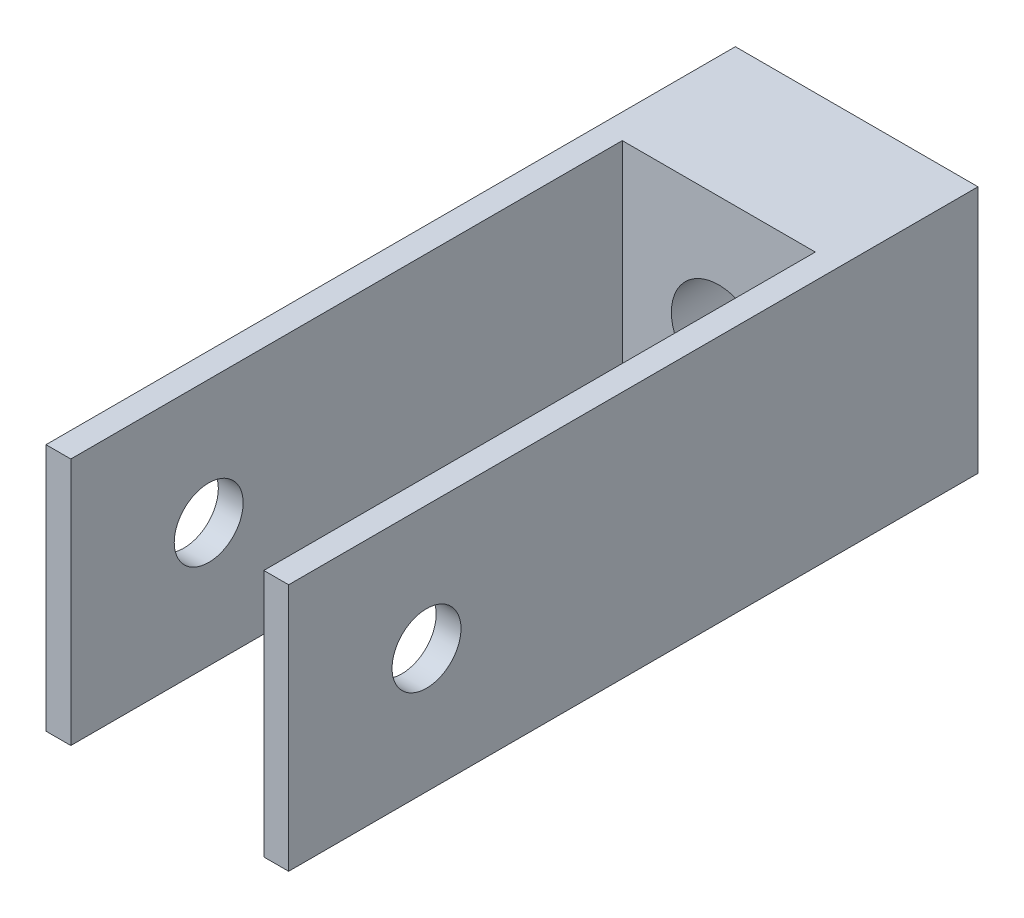
ISO-10303-21;
HEADER;
FILE_DESCRIPTION(('STEP AP214'),'2;1');
FILE_NAME('part.step','',(''),(''),'','','');
FILE_SCHEMA(('AUTOMOTIVE_DESIGN { 1 0 10303 214 1 1 1 1 }'));
ENDSEC;
DATA;
#1=APPLICATION_CONTEXT('core data for automotive mechanical design processes');
#2=APPLICATION_PROTOCOL_DEFINITION('international standard','automotive_design',2000,#1);
#3=PRODUCT_CONTEXT('',#1,'mechanical');
#4=PRODUCT('Part','Part','',(#3));
#5=PRODUCT_RELATED_PRODUCT_CATEGORY('part','',(#4));
#6=PRODUCT_DEFINITION_FORMATION('','',#4);
#7=PRODUCT_DEFINITION_CONTEXT('part definition',#1,'design');
#8=PRODUCT_DEFINITION('design','',#6,#7);
#9=PRODUCT_DEFINITION_SHAPE('','',#8);
#10=(LENGTH_UNIT() NAMED_UNIT(*) SI_UNIT(.MILLI.,.METRE.));
#11=(NAMED_UNIT(*) PLANE_ANGLE_UNIT() SI_UNIT($,.RADIAN.));
#12=(NAMED_UNIT(*) SI_UNIT($,.STERADIAN.) SOLID_ANGLE_UNIT());
#13=UNCERTAINTY_MEASURE_WITH_UNIT(LENGTH_MEASURE(1.E-05),#10,'distance_accuracy_value','');
#14=(GEOMETRIC_REPRESENTATION_CONTEXT(3) GLOBAL_UNCERTAINTY_ASSIGNED_CONTEXT((#13)) GLOBAL_UNIT_ASSIGNED_CONTEXT((#10,
#11,#12)) REPRESENTATION_CONTEXT('',''));
#15=CARTESIAN_POINT('',(0.,0.,0.));
#16=DIRECTION('',(0.,0.,1.));
#17=DIRECTION('',(1.,0.,0.));
#18=AXIS2_PLACEMENT_3D('',#15,#16,#17);
#19=CARTESIAN_POINT('',(-11.176,22.86,-38.1));
#20=DIRECTION('',(1.,0.,0.));
#21=DIRECTION('',(0.,0.,-1.));
#22=AXIS2_PLACEMENT_3D('',#19,#20,#21);
#23=PLANE('',#22);
#24=CARTESIAN_POINT('',(-11.176,11.43,12.7));
#25=DIRECTION('',(1.,0.,0.));
#26=DIRECTION('',(0.,0.,-1.));
#27=AXIS2_PLACEMENT_3D('',#24,#25,#26);
#28=CIRCLE('',#27,3.175);
#29=CARTESIAN_POINT('',(-11.176,11.43,9.525));
#30=VERTEX_POINT('',#29);
#31=EDGE_CURVE('E214',#30,#30,#28,.T.);
#32=ORIENTED_EDGE('',*,*,#31,.T.);
#33=EDGE_LOOP('',(#32));
#34=FACE_BOUND('',#33,.T.);
#35=DIRECTION('',(0.,0.,1.));
#36=VECTOR('',#35,1.);
#37=CARTESIAN_POINT('',(-11.176,0.,-38.1));
#38=LINE('',#37,#36);
#39=CARTESIAN_POINT('',(-11.176,0.,-38.1));
#40=VERTEX_POINT('',#39);
#41=CARTESIAN_POINT('',(-11.176,0.,25.4));
#42=VERTEX_POINT('',#41);
#43=EDGE_CURVE('E140',#40,#42,#38,.T.);
#44=ORIENTED_EDGE('',*,*,#43,.T.);
#45=DIRECTION('',(0.,-1.,0.));
#46=VECTOR('',#45,1.);
#47=CARTESIAN_POINT('',(-11.176,22.86,25.4));
#48=LINE('',#47,#46);
#49=CARTESIAN_POINT('',(-11.176,22.86,25.4));
#50=VERTEX_POINT('',#49);
#51=EDGE_CURVE('E11',#50,#42,#48,.T.);
#52=ORIENTED_EDGE('',*,*,#51,.F.);
#53=DIRECTION('',(0.,0.,1.));
#54=VECTOR('',#53,1.);
#55=CARTESIAN_POINT('',(-11.176,22.86,-38.1));
#56=LINE('',#55,#54);
#57=CARTESIAN_POINT('',(-11.176,22.86,-38.1));
#58=VERTEX_POINT('',#57);
#59=EDGE_CURVE('E163',#58,#50,#56,.T.);
#60=ORIENTED_EDGE('',*,*,#59,.F.);
#61=DIRECTION('',(0.,-1.,0.));
#62=VECTOR('',#61,1.);
#63=CARTESIAN_POINT('',(-11.176,22.86,-38.1));
#64=LINE('',#63,#62);
#65=EDGE_CURVE('E136',#58,#40,#64,.T.);
#66=ORIENTED_EDGE('',*,*,#65,.T.);
#67=EDGE_LOOP('',(#44,#52,#60,#66));
#68=FACE_BOUND('',#67,.T.);
#69=ADVANCED_FACE('F39',(#34,#68),#23,.F.);
#70=CARTESIAN_POINT('',(-11.176,22.86,25.4));
#71=DIRECTION('',(0.,0.,-1.));
#72=DIRECTION('',(-1.,0.,0.));
#73=AXIS2_PLACEMENT_3D('',#70,#71,#72);
#74=PLANE('',#73);
#75=DIRECTION('',(1.,0.,0.));
#76=VECTOR('',#75,1.);
#77=CARTESIAN_POINT('',(-11.176,0.,25.4));
#78=LINE('',#77,#76);
#79=CARTESIAN_POINT('',(-8.89,0.,25.4));
#80=VERTEX_POINT('',#79);
#81=EDGE_CURVE('E144',#42,#80,#78,.T.);
#82=ORIENTED_EDGE('',*,*,#81,.T.);
#83=DIRECTION('',(0.,-1.,0.));
#84=VECTOR('',#83,1.);
#85=CARTESIAN_POINT('',(-8.89,22.86,25.4));
#86=LINE('',#85,#84);
#87=CARTESIAN_POINT('',(-8.89,22.86,25.4));
#88=VERTEX_POINT('',#87);
#89=EDGE_CURVE('E48',#88,#80,#86,.T.);
#90=ORIENTED_EDGE('',*,*,#89,.F.);
#91=DIRECTION('',(1.,0.,0.));
#92=VECTOR('',#91,1.);
#93=CARTESIAN_POINT('',(-11.176,22.86,25.4));
#94=LINE('',#93,#92);
#95=EDGE_CURVE('E99',#50,#88,#94,.T.);
#96=ORIENTED_EDGE('',*,*,#95,.F.);
#97=ORIENTED_EDGE('',*,*,#51,.T.);
#98=EDGE_LOOP('',(#82,#90,#96,#97));
#99=FACE_BOUND('',#98,.T.);
#100=ADVANCED_FACE('F246',(#99),#74,.F.);
#101=CARTESIAN_POINT('',(-8.89,22.86,-25.4));
#102=DIRECTION('',(-1.,0.,0.));
#103=DIRECTION('',(0.,0.,1.));
#104=AXIS2_PLACEMENT_3D('',#101,#102,#103);
#105=PLANE('',#104);
#106=CARTESIAN_POINT('',(-8.89,11.43,12.7));
#107=DIRECTION('',(-1.,0.,0.));
#108=DIRECTION('',(0.,0.,1.));
#109=AXIS2_PLACEMENT_3D('',#106,#107,#108);
#110=CIRCLE('',#109,3.175);
#111=CARTESIAN_POINT('',(-8.89,11.43,15.875));
#112=VERTEX_POINT('',#111);
#113=EDGE_CURVE('E145',#112,#112,#110,.T.);
#114=ORIENTED_EDGE('',*,*,#113,.T.);
#115=EDGE_LOOP('',(#114));
#116=FACE_BOUND('',#115,.T.);
#117=DIRECTION('',(0.,0.,-1.));
#118=VECTOR('',#117,1.);
#119=CARTESIAN_POINT('',(-8.89,0.,-25.4));
#120=LINE('',#119,#118);
#121=CARTESIAN_POINT('',(-8.89,0.,-25.4));
#122=VERTEX_POINT('',#121);
#123=EDGE_CURVE('E148',#80,#122,#120,.T.);
#124=ORIENTED_EDGE('',*,*,#123,.T.);
#125=DIRECTION('',(0.,-1.,0.));
#126=VECTOR('',#125,1.);
#127=CARTESIAN_POINT('',(-8.89,22.86,-25.4));
#128=LINE('',#127,#126);
#129=CARTESIAN_POINT('',(-8.89,22.86,-25.4));
#130=VERTEX_POINT('',#129);
#131=EDGE_CURVE('E174',#130,#122,#128,.T.);
#132=ORIENTED_EDGE('',*,*,#131,.F.);
#133=DIRECTION('',(0.,0.,-1.));
#134=VECTOR('',#133,1.);
#135=CARTESIAN_POINT('',(-8.89,22.86,-25.4));
#136=LINE('',#135,#134);
#137=EDGE_CURVE('E184',#88,#130,#136,.T.);
#138=ORIENTED_EDGE('',*,*,#137,.F.);
#139=ORIENTED_EDGE('',*,*,#89,.T.);
#140=EDGE_LOOP('',(#124,#132,#138,#139));
#141=FACE_BOUND('',#140,.T.);
#142=ADVANCED_FACE('F182',(#116,#141),#105,.F.);
#143=CARTESIAN_POINT('',(-8.89,22.86,-25.4));
#144=DIRECTION('',(0.,0.,-1.));
#145=DIRECTION('',(-1.,0.,0.));
#146=AXIS2_PLACEMENT_3D('',#143,#144,#145);
#147=PLANE('',#146);
#148=CARTESIAN_POINT('',(0.,11.43,-25.4));
#149=DIRECTION('',(0.,0.,-1.));
#150=DIRECTION('',(-1.,0.,0.));
#151=AXIS2_PLACEMENT_3D('',#148,#149,#150);
#152=CIRCLE('',#151,4.365625);
#153=CARTESIAN_POINT('',(-4.365625,11.43,-25.4));
#154=VERTEX_POINT('',#153);
#155=EDGE_CURVE('E219',#154,#154,#152,.T.);
#156=ORIENTED_EDGE('',*,*,#155,.T.);
#157=EDGE_LOOP('',(#156));
#158=FACE_BOUND('',#157,.T.);
#159=DIRECTION('',(1.,0.,0.));
#160=VECTOR('',#159,1.);
#161=CARTESIAN_POINT('',(-8.89,0.,-25.4));
#162=LINE('',#161,#160);
#163=CARTESIAN_POINT('',(8.89,0.,-25.4));
#164=VERTEX_POINT('',#163);
#165=EDGE_CURVE('E151',#122,#164,#162,.T.);
#166=ORIENTED_EDGE('',*,*,#165,.T.);
#167=DIRECTION('',(0.,-1.,0.));
#168=VECTOR('',#167,1.);
#169=CARTESIAN_POINT('',(8.89,22.86,-25.4));
#170=LINE('',#169,#168);
#171=CARTESIAN_POINT('',(8.89,22.86,-25.4));
#172=VERTEX_POINT('',#171);
#173=EDGE_CURVE('E170',#172,#164,#170,.T.);
#174=ORIENTED_EDGE('',*,*,#173,.F.);
#175=DIRECTION('',(1.,0.,0.));
#176=VECTOR('',#175,1.);
#177=CARTESIAN_POINT('',(-8.89,22.86,-25.4));
#178=LINE('',#177,#176);
#179=EDGE_CURVE('E197',#130,#172,#178,.T.);
#180=ORIENTED_EDGE('',*,*,#179,.F.);
#181=ORIENTED_EDGE('',*,*,#131,.T.);
#182=EDGE_LOOP('',(#166,#174,#180,#181));
#183=FACE_BOUND('',#182,.T.);
#184=ADVANCED_FACE('F192',(#158,#183),#147,.F.);
#185=CARTESIAN_POINT('',(8.89,22.86,-25.4));
#186=DIRECTION('',(1.,0.,0.));
#187=DIRECTION('',(0.,0.,-1.));
#188=AXIS2_PLACEMENT_3D('',#185,#186,#187);
#189=PLANE('',#188);
#190=CARTESIAN_POINT('',(8.89,11.43,12.7));
#191=DIRECTION('',(1.,0.,0.));
#192=DIRECTION('',(0.,0.,-1.));
#193=AXIS2_PLACEMENT_3D('',#190,#191,#192);
#194=CIRCLE('',#193,3.175);
#195=CARTESIAN_POINT('',(8.89,11.43,9.525));
#196=VERTEX_POINT('',#195);
#197=EDGE_CURVE('E210',#196,#196,#194,.T.);
#198=ORIENTED_EDGE('',*,*,#197,.T.);
#199=EDGE_LOOP('',(#198));
#200=FACE_BOUND('',#199,.T.);
#201=DIRECTION('',(0.,0.,1.));
#202=VECTOR('',#201,1.);
#203=CARTESIAN_POINT('',(8.89,0.,-25.4));
#204=LINE('',#203,#202);
#205=CARTESIAN_POINT('',(8.89,0.,25.4));
#206=VERTEX_POINT('',#205);
#207=EDGE_CURVE('E154',#164,#206,#204,.T.);
#208=ORIENTED_EDGE('',*,*,#207,.T.);
#209=DIRECTION('',(0.,-1.,0.));
#210=VECTOR('',#209,1.);
#211=CARTESIAN_POINT('',(8.89,22.86,25.4));
#212=LINE('',#211,#210);
#213=CARTESIAN_POINT('',(8.89,22.86,25.4));
#214=VERTEX_POINT('',#213);
#215=EDGE_CURVE('E129',#214,#206,#212,.T.);
#216=ORIENTED_EDGE('',*,*,#215,.F.);
#217=DIRECTION('',(0.,0.,1.));
#218=VECTOR('',#217,1.);
#219=CARTESIAN_POINT('',(8.89,22.86,-25.4));
#220=LINE('',#219,#218);
#221=EDGE_CURVE('E118',#172,#214,#220,.T.);
#222=ORIENTED_EDGE('',*,*,#221,.F.);
#223=ORIENTED_EDGE('',*,*,#173,.T.);
#224=EDGE_LOOP('',(#208,#216,#222,#223));
#225=FACE_BOUND('',#224,.T.);
#226=ADVANCED_FACE('F195',(#200,#225),#189,.F.);
#227=CARTESIAN_POINT('',(8.89,22.86,25.4));
#228=DIRECTION('',(0.,0.,-1.));
#229=DIRECTION('',(-1.,0.,0.));
#230=AXIS2_PLACEMENT_3D('',#227,#228,#229);
#231=PLANE('',#230);
#232=DIRECTION('',(1.,0.,0.));
#233=VECTOR('',#232,1.);
#234=CARTESIAN_POINT('',(8.89,0.,25.4));
#235=LINE('',#234,#233);
#236=CARTESIAN_POINT('',(11.176,0.,25.4));
#237=VERTEX_POINT('',#236);
#238=EDGE_CURVE('E127',#206,#237,#235,.T.);
#239=ORIENTED_EDGE('',*,*,#238,.T.);
#240=DIRECTION('',(0.,-1.,0.));
#241=VECTOR('',#240,1.);
#242=CARTESIAN_POINT('',(11.176,22.86,25.4));
#243=LINE('',#242,#241);
#244=CARTESIAN_POINT('',(11.176,22.86,25.4));
#245=VERTEX_POINT('',#244);
#246=EDGE_CURVE('E124',#245,#237,#243,.T.);
#247=ORIENTED_EDGE('',*,*,#246,.F.);
#248=DIRECTION('',(1.,0.,0.));
#249=VECTOR('',#248,1.);
#250=CARTESIAN_POINT('',(8.89,22.86,25.4));
#251=LINE('',#250,#249);
#252=EDGE_CURVE('E112',#214,#245,#251,.T.);
#253=ORIENTED_EDGE('',*,*,#252,.F.);
#254=ORIENTED_EDGE('',*,*,#215,.T.);
#255=EDGE_LOOP('',(#239,#247,#253,#254));
#256=FACE_BOUND('',#255,.T.);
#257=ADVANCED_FACE('F125',(#256),#231,.F.);
#258=CARTESIAN_POINT('',(11.176,22.86,-38.1));
#259=DIRECTION('',(-1.,0.,0.));
#260=DIRECTION('',(0.,0.,1.));
#261=AXIS2_PLACEMENT_3D('',#258,#259,#260);
#262=PLANE('',#261);
#263=CARTESIAN_POINT('',(11.176,11.43,12.7));
#264=DIRECTION('',(1.,0.,0.));
#265=DIRECTION('',(0.,0.,-1.));
#266=AXIS2_PLACEMENT_3D('',#263,#264,#265);
#267=CIRCLE('',#266,3.175);
#268=CARTESIAN_POINT('',(11.176,11.43,9.525));
#269=VERTEX_POINT('',#268);
#270=EDGE_CURVE('E215',#269,#269,#267,.T.);
#271=ORIENTED_EDGE('',*,*,#270,.F.);
#272=EDGE_LOOP('',(#271));
#273=FACE_BOUND('',#272,.T.);
#274=DIRECTION('',(0.,0.,-1.));
#275=VECTOR('',#274,1.);
#276=CARTESIAN_POINT('',(11.176,0.,-38.1));
#277=LINE('',#276,#275);
#278=CARTESIAN_POINT('',(11.176,0.,-38.1));
#279=VERTEX_POINT('',#278);
#280=EDGE_CURVE('E85',#237,#279,#277,.T.);
#281=ORIENTED_EDGE('',*,*,#280,.T.);
#282=DIRECTION('',(0.,-1.,0.));
#283=VECTOR('',#282,1.);
#284=CARTESIAN_POINT('',(11.176,22.86,-38.1));
#285=LINE('',#284,#283);
#286=CARTESIAN_POINT('',(11.176,22.86,-38.1));
#287=VERTEX_POINT('',#286);
#288=EDGE_CURVE('E130',#287,#279,#285,.T.);
#289=ORIENTED_EDGE('',*,*,#288,.F.);
#290=DIRECTION('',(0.,0.,-1.));
#291=VECTOR('',#290,1.);
#292=CARTESIAN_POINT('',(11.176,22.86,-38.1));
#293=LINE('',#292,#291);
#294=EDGE_CURVE('E116',#245,#287,#293,.T.);
#295=ORIENTED_EDGE('',*,*,#294,.F.);
#296=ORIENTED_EDGE('',*,*,#246,.T.);
#297=EDGE_LOOP('',(#281,#289,#295,#296));
#298=FACE_BOUND('',#297,.T.);
#299=ADVANCED_FACE('F132',(#273,#298),#262,.F.);
#300=CARTESIAN_POINT('',(-11.176,22.86,-38.1));
#301=DIRECTION('',(0.,0.,1.));
#302=DIRECTION('',(1.,0.,0.));
#303=AXIS2_PLACEMENT_3D('',#300,#301,#302);
#304=PLANE('',#303);
#305=CARTESIAN_POINT('',(0.,11.43,-38.1));
#306=DIRECTION('',(0.,0.,-1.));
#307=DIRECTION('',(-1.,0.,0.));
#308=AXIS2_PLACEMENT_3D('',#305,#306,#307);
#309=CIRCLE('',#308,4.365625);
#310=CARTESIAN_POINT('',(-4.365625,11.43,-38.1));
#311=VERTEX_POINT('',#310);
#312=EDGE_CURVE('E226',#311,#311,#309,.T.);
#313=ORIENTED_EDGE('',*,*,#312,.F.);
#314=EDGE_LOOP('',(#313));
#315=FACE_BOUND('',#314,.T.);
#316=DIRECTION('',(-1.,0.,0.));
#317=VECTOR('',#316,1.);
#318=CARTESIAN_POINT('',(-11.176,0.,-38.1));
#319=LINE('',#318,#317);
#320=EDGE_CURVE('E91',#279,#40,#319,.T.);
#321=ORIENTED_EDGE('',*,*,#320,.T.);
#322=ORIENTED_EDGE('',*,*,#65,.F.);
#323=DIRECTION('',(-1.,0.,0.));
#324=VECTOR('',#323,1.);
#325=CARTESIAN_POINT('',(-11.176,22.86,-38.1));
#326=LINE('',#325,#324);
#327=EDGE_CURVE('E56',#287,#58,#326,.T.);
#328=ORIENTED_EDGE('',*,*,#327,.F.);
#329=ORIENTED_EDGE('',*,*,#288,.T.);
#330=EDGE_LOOP('',(#321,#322,#328,#329));
#331=FACE_BOUND('',#330,.T.);
#332=ADVANCED_FACE('F234',(#315,#331),#304,.F.);
#333=CARTESIAN_POINT('',(0.,22.86,0.));
#334=DIRECTION('',(0.,1.,0.));
#335=DIRECTION('',(0.,0.,1.));
#336=AXIS2_PLACEMENT_3D('',#333,#334,#335);
#337=PLANE('',#336);
#338=ORIENTED_EDGE('',*,*,#59,.T.);
#339=ORIENTED_EDGE('',*,*,#95,.T.);
#340=ORIENTED_EDGE('',*,*,#137,.T.);
#341=ORIENTED_EDGE('',*,*,#179,.T.);
#342=ORIENTED_EDGE('',*,*,#221,.T.);
#343=ORIENTED_EDGE('',*,*,#252,.T.);
#344=ORIENTED_EDGE('',*,*,#294,.T.);
#345=ORIENTED_EDGE('',*,*,#327,.T.);
#346=EDGE_LOOP('',(#338,#339,#340,#341,#342,#343,#344,#345));
#347=FACE_BOUND('',#346,.T.);
#348=ADVANCED_FACE('F114',(#347),#337,.T.);
#349=CARTESIAN_POINT('',(0.,0.,0.));
#350=DIRECTION('',(0.,1.,0.));
#351=DIRECTION('',(0.,0.,1.));
#352=AXIS2_PLACEMENT_3D('',#349,#350,#351);
#353=PLANE('',#352);
#354=ORIENTED_EDGE('',*,*,#43,.F.);
#355=ORIENTED_EDGE('',*,*,#320,.F.);
#356=ORIENTED_EDGE('',*,*,#280,.F.);
#357=ORIENTED_EDGE('',*,*,#238,.F.);
#358=ORIENTED_EDGE('',*,*,#207,.F.);
#359=ORIENTED_EDGE('',*,*,#165,.F.);
#360=ORIENTED_EDGE('',*,*,#123,.F.);
#361=ORIENTED_EDGE('',*,*,#81,.F.);
#362=EDGE_LOOP('',(#354,#355,#356,#357,#358,#359,#360,#361));
#363=FACE_BOUND('',#362,.T.);
#364=ADVANCED_FACE('F188',(#363),#353,.F.);
#365=CARTESIAN_POINT('',(-11.176,11.43,12.7));
#366=DIRECTION('',(1.,0.,0.));
#367=DIRECTION('',(0.,0.,-1.));
#368=AXIS2_PLACEMENT_3D('',#365,#366,#367);
#369=CYLINDRICAL_SURFACE('',#368,3.175);
#370=ORIENTED_EDGE('',*,*,#270,.T.);
#371=EDGE_LOOP('',(#370));
#372=FACE_BOUND('',#371,.T.);
#373=ORIENTED_EDGE('',*,*,#197,.F.);
#374=EDGE_LOOP('',(#373));
#375=FACE_BOUND('',#374,.T.);
#376=ADVANCED_FACE('F259',(#372,#375),#369,.F.);
#377=ORIENTED_EDGE('',*,*,#31,.F.);
#378=EDGE_LOOP('',(#377));
#379=FACE_BOUND('',#378,.T.);
#380=ORIENTED_EDGE('',*,*,#113,.F.);
#381=EDGE_LOOP('',(#380));
#382=FACE_BOUND('',#381,.T.);
#383=ADVANCED_FACE('F256',(#379,#382),#369,.F.);
#384=CARTESIAN_POINT('',(0.,11.43,-14.478));
#385=DIRECTION('',(0.,0.,-1.));
#386=DIRECTION('',(-1.,0.,0.));
#387=AXIS2_PLACEMENT_3D('',#384,#385,#386);
#388=CYLINDRICAL_SURFACE('',#387,4.365625);
#389=ORIENTED_EDGE('',*,*,#312,.T.);
#390=EDGE_LOOP('',(#389));
#391=FACE_BOUND('',#390,.T.);
#392=ORIENTED_EDGE('',*,*,#155,.F.);
#393=EDGE_LOOP('',(#392));
#394=FACE_BOUND('',#393,.T.);
#395=ADVANCED_FACE('F231',(#391,#394),#388,.F.);
#396=CLOSED_SHELL('',(#69,#100,#142,#184,#226,#257,#299,#332,#348,#364,#376,#383,#395));
#397=MANIFOLD_SOLID_BREP('B2',#396);
#398=ADVANCED_BREP_SHAPE_REPRESENTATION('',(#18,#397),#14);
#399=SHAPE_DEFINITION_REPRESENTATION(#9,#398);
ENDSEC;
END-ISO-10303-21;
